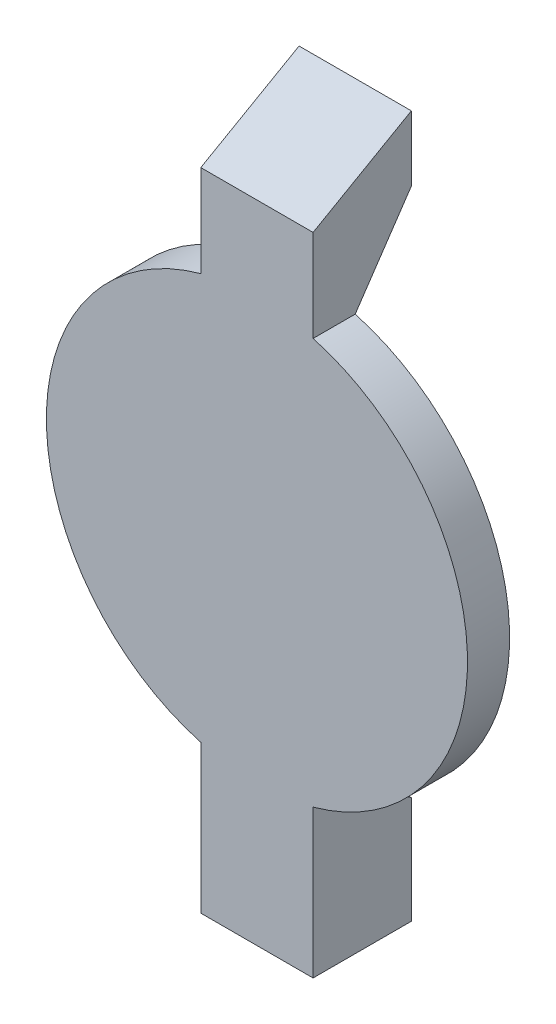
ISO-10303-21;
HEADER;
FILE_DESCRIPTION(('STEP AP214'),'2;1');
FILE_NAME('part.step','',(''),(''),'','','');
FILE_SCHEMA(('AUTOMOTIVE_DESIGN { 1 0 10303 214 1 1 1 1 }'));
ENDSEC;
DATA;
#1=APPLICATION_CONTEXT('core data for automotive mechanical design processes');
#2=APPLICATION_PROTOCOL_DEFINITION('international standard','automotive_design',2000,#1);
#3=PRODUCT_CONTEXT('',#1,'mechanical');
#4=PRODUCT('Part','Part','',(#3));
#5=PRODUCT_RELATED_PRODUCT_CATEGORY('part','',(#4));
#6=PRODUCT_DEFINITION_FORMATION('','',#4);
#7=PRODUCT_DEFINITION_CONTEXT('part definition',#1,'design');
#8=PRODUCT_DEFINITION('design','',#6,#7);
#9=PRODUCT_DEFINITION_SHAPE('','',#8);
#10=(LENGTH_UNIT() NAMED_UNIT(*) SI_UNIT(.MILLI.,.METRE.));
#11=(NAMED_UNIT(*) PLANE_ANGLE_UNIT() SI_UNIT($,.RADIAN.));
#12=(NAMED_UNIT(*) SI_UNIT($,.STERADIAN.) SOLID_ANGLE_UNIT());
#13=UNCERTAINTY_MEASURE_WITH_UNIT(LENGTH_MEASURE(1.E-05),#10,'distance_accuracy_value','');
#14=(GEOMETRIC_REPRESENTATION_CONTEXT(3) GLOBAL_UNCERTAINTY_ASSIGNED_CONTEXT((#13)) GLOBAL_UNIT_ASSIGNED_CONTEXT((#10,
#11,#12)) REPRESENTATION_CONTEXT('',''));
#15=CARTESIAN_POINT('',(0.,0.,0.));
#16=DIRECTION('',(0.,0.,1.));
#17=DIRECTION('',(1.,0.,0.));
#18=AXIS2_PLACEMENT_3D('',#15,#16,#17);
#19=CARTESIAN_POINT('',(-54.0645161290324,3.51612903225812,0.));
#20=DIRECTION('',(0.,0.,1.));
#21=DIRECTION('',(1.,0.,0.));
#22=AXIS2_PLACEMENT_3D('',#19,#20,#21);
#23=PLANE('',#22);
#24=DIRECTION('',(0.,1.,0.));
#25=VECTOR('',#24,1.);
#26=CARTESIAN_POINT('',(-50.0645161290324,28.5161290322581,0.));
#27=LINE('',#26,#25);
#28=CARTESIAN_POINT('',(-50.0645161290324,23.8720744897449,0.));
#29=VERTEX_POINT('',#28);
#30=CARTESIAN_POINT('',(-50.0645161290324,28.5161290322581,0.));
#31=VERTEX_POINT('',#30);
#32=EDGE_CURVE('E72',#29,#31,#27,.T.);
#33=ORIENTED_EDGE('',*,*,#32,.F.);
#34=DIRECTION('',(-1.,0.,0.));
#35=VECTOR('',#34,1.);
#36=CARTESIAN_POINT('',(-54.0645161290324,23.8720744897449,0.));
#37=LINE('',#36,#35);
#38=CARTESIAN_POINT('',(-58.0645161290324,23.8720744897449,0.));
#39=VERTEX_POINT('',#38);
#40=EDGE_CURVE('E11',#29,#39,#37,.T.);
#41=ORIENTED_EDGE('',*,*,#40,.T.);
#42=DIRECTION('',(0.,-1.,0.));
#43=VECTOR('',#42,1.);
#44=CARTESIAN_POINT('',(-58.0645161290324,28.5161290322581,0.));
#45=LINE('',#44,#43);
#46=CARTESIAN_POINT('',(-58.0645161290324,28.5161290322581,0.));
#47=VERTEX_POINT('',#46);
#48=EDGE_CURVE('E118',#47,#39,#45,.T.);
#49=ORIENTED_EDGE('',*,*,#48,.F.);
#50=DIRECTION('',(-1.,0.,0.));
#51=VECTOR('',#50,1.);
#52=CARTESIAN_POINT('',(-58.0645161290324,28.5161290322581,0.));
#53=LINE('',#52,#51);
#54=EDGE_CURVE('E128',#31,#47,#53,.T.);
#55=ORIENTED_EDGE('',*,*,#54,.F.);
#56=EDGE_LOOP('',(#33,#41,#49,#55));
#57=FACE_BOUND('',#56,.T.);
#58=ADVANCED_FACE('F32',(#57),#23,.F.);
#59=CARTESIAN_POINT('',(-58.0645161290324,28.5161290322581,7.));
#60=DIRECTION('',(1.,0.,0.));
#61=DIRECTION('',(0.,0.,-1.));
#62=AXIS2_PLACEMENT_3D('',#59,#60,#61);
#63=PLANE('',#62);
#64=DIRECTION('',(0.,-0.827669314342992,0.561216095719822));
#65=VECTOR('',#64,1.);
#66=CARTESIAN_POINT('',(-58.0645161290324,23.8720744897449,0.));
#67=LINE('',#66,#65);
#68=CARTESIAN_POINT('',(-58.0645161290324,17.9729613270591,4.));
#69=VERTEX_POINT('',#68);
#70=EDGE_CURVE('E204',#39,#69,#67,.T.);
#71=ORIENTED_EDGE('',*,*,#70,.T.);
#72=DIRECTION('',(0.,0.,-1.));
#73=VECTOR('',#72,1.);
#74=CARTESIAN_POINT('',(-58.0645161290324,17.9729613270591,7.));
#75=LINE('',#74,#73);
#76=CARTESIAN_POINT('',(-58.0645161290324,17.9729613270591,7.));
#77=VERTEX_POINT('',#76);
#78=EDGE_CURVE('E138',#77,#69,#75,.T.);
#79=ORIENTED_EDGE('',*,*,#78,.F.);
#80=DIRECTION('',(0.,-1.,0.));
#81=VECTOR('',#80,1.);
#82=CARTESIAN_POINT('',(-58.0645161290324,28.5161290322581,7.));
#83=LINE('',#82,#81);
#84=CARTESIAN_POINT('',(-58.0645161290324,24.5161290322581,7.));
#85=VERTEX_POINT('',#84);
#86=EDGE_CURVE('E80',#85,#77,#83,.T.);
#87=ORIENTED_EDGE('',*,*,#86,.F.);
#88=DIRECTION('',(0.,-0.496138938356834,0.868243142124459));
#89=VECTOR('',#88,1.);
#90=CARTESIAN_POINT('',(-58.0645161290324,24.5161290322581,7.));
#91=LINE('',#90,#89);
#92=EDGE_CURVE('E212',#47,#85,#91,.T.);
#93=ORIENTED_EDGE('',*,*,#92,.F.);
#94=ORIENTED_EDGE('',*,*,#48,.T.);
#95=EDGE_LOOP('',(#71,#79,#87,#93,#94));
#96=FACE_BOUND('',#95,.T.);
#97=ADVANCED_FACE('F34',(#96),#63,.F.);
#98=CARTESIAN_POINT('',(-54.0645161290324,3.51612903225812,7.));
#99=DIRECTION('',(0.,0.,-1.));
#100=DIRECTION('',(-1.,0.,0.));
#101=AXIS2_PLACEMENT_3D('',#98,#99,#100);
#102=CYLINDRICAL_SURFACE('',#101,15.);
#103=CARTESIAN_POINT('',(-54.0645161290324,3.51612903225812,4.));
#104=DIRECTION('',(0.,0.,1.));
#105=DIRECTION('',(0.,-1.,0.));
#106=AXIS2_PLACEMENT_3D('',#103,#104,#105);
#107=CIRCLE('',#106,15.);
#108=CARTESIAN_POINT('',(-58.0645161290324,-10.9407032625428,4.));
#109=VERTEX_POINT('',#108);
#110=EDGE_CURVE('E173',#69,#109,#107,.T.);
#111=ORIENTED_EDGE('',*,*,#110,.T.);
#112=DIRECTION('',(0.,0.,-1.));
#113=VECTOR('',#112,1.);
#114=CARTESIAN_POINT('',(-58.0645161290324,-10.9407032625428,7.));
#115=LINE('',#114,#113);
#116=CARTESIAN_POINT('',(-58.0645161290324,-10.9407032625428,7.));
#117=VERTEX_POINT('',#116);
#118=EDGE_CURVE('E135',#117,#109,#115,.T.);
#119=ORIENTED_EDGE('',*,*,#118,.F.);
#120=CARTESIAN_POINT('',(-54.0645161290324,3.51612903225812,7.));
#121=DIRECTION('',(0.,0.,1.));
#122=DIRECTION('',(1.,0.,0.));
#123=AXIS2_PLACEMENT_3D('',#120,#121,#122);
#124=CIRCLE('',#123,15.);
#125=EDGE_CURVE('E215',#77,#117,#124,.T.);
#126=ORIENTED_EDGE('',*,*,#125,.F.);
#127=ORIENTED_EDGE('',*,*,#78,.T.);
#128=EDGE_LOOP('',(#111,#119,#126,#127));
#129=FACE_BOUND('',#128,.T.);
#130=ADVANCED_FACE('F214',(#129),#102,.T.);
#131=CARTESIAN_POINT('',(-58.0645161290324,-10.9407032625428,7.));
#132=DIRECTION('',(1.,0.,0.));
#133=DIRECTION('',(0.,0.,-1.));
#134=AXIS2_PLACEMENT_3D('',#131,#132,#133);
#135=PLANE('',#134);
#136=ORIENTED_EDGE('',*,*,#118,.T.);
#137=DIRECTION('',(0.,-0.589013865697566,-0.808122927540117));
#138=VECTOR('',#137,1.);
#139=CARTESIAN_POINT('',(-58.0645161290324,-13.8561699353694,0.));
#140=LINE('',#139,#138);
#141=CARTESIAN_POINT('',(-58.0645161290324,-13.8561699353694,0.));
#142=VERTEX_POINT('',#141);
#143=EDGE_CURVE('E159',#109,#142,#140,.T.);
#144=ORIENTED_EDGE('',*,*,#143,.T.);
#145=DIRECTION('',(0.,-1.,0.));
#146=VECTOR('',#145,1.);
#147=CARTESIAN_POINT('',(-58.0645161290324,-10.9407032625428,0.));
#148=LINE('',#147,#146);
#149=CARTESIAN_POINT('',(-58.0645161290324,-21.4838709677419,0.));
#150=VERTEX_POINT('',#149);
#151=EDGE_CURVE('E121',#142,#150,#148,.T.);
#152=ORIENTED_EDGE('',*,*,#151,.T.);
#153=DIRECTION('',(0.,0.,-1.));
#154=VECTOR('',#153,1.);
#155=CARTESIAN_POINT('',(-58.0645161290324,-21.4838709677419,7.));
#156=LINE('',#155,#154);
#157=CARTESIAN_POINT('',(-58.0645161290324,-21.4838709677419,7.));
#158=VERTEX_POINT('',#157);
#159=EDGE_CURVE('E105',#158,#150,#156,.T.);
#160=ORIENTED_EDGE('',*,*,#159,.F.);
#161=DIRECTION('',(0.,-1.,0.));
#162=VECTOR('',#161,1.);
#163=CARTESIAN_POINT('',(-58.0645161290324,-10.9407032625428,7.));
#164=LINE('',#163,#162);
#165=EDGE_CURVE('E97',#117,#158,#164,.T.);
#166=ORIENTED_EDGE('',*,*,#165,.F.);
#167=EDGE_LOOP('',(#136,#144,#152,#160,#166));
#168=FACE_BOUND('',#167,.T.);
#169=ADVANCED_FACE('F293',(#168),#135,.F.);
#170=CARTESIAN_POINT('',(-58.0645161290324,-21.4838709677419,7.));
#171=DIRECTION('',(0.,1.,0.));
#172=DIRECTION('',(0.,0.,1.));
#173=AXIS2_PLACEMENT_3D('',#170,#171,#172);
#174=PLANE('',#173);
#175=CARTESIAN_POINT('',(-54.0645161290324,-21.4838709677419,3.5));
#176=DIRECTION('',(0.,-1.,0.));
#177=DIRECTION('',(0.,0.,-1.));
#178=AXIS2_PLACEMENT_3D('',#175,#176,#177);
#179=CIRCLE('',#178,2.4);
#180=CARTESIAN_POINT('',(-54.0645161290324,-21.4838709677419,1.1));
#181=VERTEX_POINT('',#180);
#182=EDGE_CURVE('E219',#181,#181,#179,.T.);
#183=ORIENTED_EDGE('',*,*,#182,.F.);
#184=EDGE_LOOP('',(#183));
#185=FACE_BOUND('',#184,.T.);
#186=DIRECTION('',(1.,0.,0.));
#187=VECTOR('',#186,1.);
#188=CARTESIAN_POINT('',(-58.0645161290324,-21.4838709677419,0.));
#189=LINE('',#188,#187);
#190=CARTESIAN_POINT('',(-50.0645161290324,-21.4838709677419,0.));
#191=VERTEX_POINT('',#190);
#192=EDGE_CURVE('E64',#150,#191,#189,.T.);
#193=ORIENTED_EDGE('',*,*,#192,.T.);
#194=DIRECTION('',(0.,0.,-1.));
#195=VECTOR('',#194,1.);
#196=CARTESIAN_POINT('',(-50.0645161290324,-21.4838709677419,7.));
#197=LINE('',#196,#195);
#198=CARTESIAN_POINT('',(-50.0645161290324,-21.4838709677419,7.));
#199=VERTEX_POINT('',#198);
#200=EDGE_CURVE('E100',#199,#191,#197,.T.);
#201=ORIENTED_EDGE('',*,*,#200,.F.);
#202=DIRECTION('',(1.,0.,0.));
#203=VECTOR('',#202,1.);
#204=CARTESIAN_POINT('',(-58.0645161290324,-21.4838709677419,7.));
#205=LINE('',#204,#203);
#206=EDGE_CURVE('E91',#158,#199,#205,.T.);
#207=ORIENTED_EDGE('',*,*,#206,.F.);
#208=ORIENTED_EDGE('',*,*,#159,.T.);
#209=EDGE_LOOP('',(#193,#201,#207,#208));
#210=FACE_BOUND('',#209,.T.);
#211=ADVANCED_FACE('F101',(#185,#210),#174,.F.);
#212=CARTESIAN_POINT('',(-50.0645161290324,-10.9407032625428,7.));
#213=DIRECTION('',(-1.,0.,0.));
#214=DIRECTION('',(0.,-1.,0.));
#215=AXIS2_PLACEMENT_3D('',#212,#213,#214);
#216=PLANE('',#215);
#217=DIRECTION('',(0.,-0.589013865697566,-0.808122927540117));
#218=VECTOR('',#217,1.);
#219=CARTESIAN_POINT('',(-50.0645161290324,-13.8561699353694,0.));
#220=LINE('',#219,#218);
#221=CARTESIAN_POINT('',(-50.0645161290324,-10.9407032625428,4.));
#222=VERTEX_POINT('',#221);
#223=CARTESIAN_POINT('',(-50.0645161290324,-13.8561699353694,0.));
#224=VERTEX_POINT('',#223);
#225=EDGE_CURVE('E153',#222,#224,#220,.T.);
#226=ORIENTED_EDGE('',*,*,#225,.F.);
#227=DIRECTION('',(0.,0.,-1.));
#228=VECTOR('',#227,1.);
#229=CARTESIAN_POINT('',(-50.0645161290324,-10.9407032625428,7.));
#230=LINE('',#229,#228);
#231=CARTESIAN_POINT('',(-50.0645161290324,-10.9407032625428,7.));
#232=VERTEX_POINT('',#231);
#233=EDGE_CURVE('E106',#232,#222,#230,.T.);
#234=ORIENTED_EDGE('',*,*,#233,.F.);
#235=DIRECTION('',(0.,1.,0.));
#236=VECTOR('',#235,1.);
#237=CARTESIAN_POINT('',(-50.0645161290324,-10.9407032625428,7.));
#238=LINE('',#237,#236);
#239=EDGE_CURVE('E94',#199,#232,#238,.T.);
#240=ORIENTED_EDGE('',*,*,#239,.F.);
#241=ORIENTED_EDGE('',*,*,#200,.T.);
#242=DIRECTION('',(0.,1.,0.));
#243=VECTOR('',#242,1.);
#244=CARTESIAN_POINT('',(-50.0645161290324,-10.9407032625428,0.));
#245=LINE('',#244,#243);
#246=EDGE_CURVE('E125',#191,#224,#245,.T.);
#247=ORIENTED_EDGE('',*,*,#246,.T.);
#248=EDGE_LOOP('',(#226,#234,#240,#241,#247));
#249=FACE_BOUND('',#248,.T.);
#250=ADVANCED_FACE('F109',(#249),#216,.F.);
#251=CARTESIAN_POINT('',(-54.0645161290324,3.51612903225812,7.));
#252=DIRECTION('',(0.,0.,-1.));
#253=DIRECTION('',(-1.,0.,0.));
#254=AXIS2_PLACEMENT_3D('',#251,#252,#253);
#255=CYLINDRICAL_SURFACE('',#254,15.);
#256=ORIENTED_EDGE('',*,*,#233,.T.);
#257=CARTESIAN_POINT('',(-54.0645161290324,3.51612903225812,4.));
#258=DIRECTION('',(0.,0.,1.));
#259=DIRECTION('',(0.,-1.,0.));
#260=AXIS2_PLACEMENT_3D('',#257,#258,#259);
#261=CIRCLE('',#260,15.);
#262=CARTESIAN_POINT('',(-50.0645161290324,17.9729613270591,4.));
#263=VERTEX_POINT('',#262);
#264=EDGE_CURVE('E165',#222,#263,#261,.T.);
#265=ORIENTED_EDGE('',*,*,#264,.T.);
#266=DIRECTION('',(0.,0.,-1.));
#267=VECTOR('',#266,1.);
#268=CARTESIAN_POINT('',(-50.0645161290324,17.9729613270591,7.));
#269=LINE('',#268,#267);
#270=CARTESIAN_POINT('',(-50.0645161290324,17.9729613270591,7.));
#271=VERTEX_POINT('',#270);
#272=EDGE_CURVE('E117',#271,#263,#269,.T.);
#273=ORIENTED_EDGE('',*,*,#272,.F.);
#274=CARTESIAN_POINT('',(-54.0645161290324,3.51612903225812,7.));
#275=DIRECTION('',(0.,0.,1.));
#276=DIRECTION('',(-1.,0.,0.));
#277=AXIS2_PLACEMENT_3D('',#274,#275,#276);
#278=CIRCLE('',#277,15.);
#279=EDGE_CURVE('E49',#232,#271,#278,.T.);
#280=ORIENTED_EDGE('',*,*,#279,.F.);
#281=EDGE_LOOP('',(#256,#265,#273,#280));
#282=FACE_BOUND('',#281,.T.);
#283=ADVANCED_FACE('F175',(#282),#255,.T.);
#284=CARTESIAN_POINT('',(-50.0645161290324,28.5161290322581,7.));
#285=DIRECTION('',(-1.,0.,0.));
#286=DIRECTION('',(0.,0.,1.));
#287=AXIS2_PLACEMENT_3D('',#284,#285,#286);
#288=PLANE('',#287);
#289=ORIENTED_EDGE('',*,*,#272,.T.);
#290=DIRECTION('',(0.,-0.827669314342992,0.561216095719822));
#291=VECTOR('',#290,1.);
#292=CARTESIAN_POINT('',(-50.0645161290324,23.8720744897449,0.));
#293=LINE('',#292,#291);
#294=EDGE_CURVE('E196',#29,#263,#293,.T.);
#295=ORIENTED_EDGE('',*,*,#294,.F.);
#296=ORIENTED_EDGE('',*,*,#32,.T.);
#297=DIRECTION('',(0.,-0.496138938356834,0.868243142124459));
#298=VECTOR('',#297,1.);
#299=CARTESIAN_POINT('',(-50.0645161290324,24.5161290322581,7.));
#300=LINE('',#299,#298);
#301=CARTESIAN_POINT('',(-50.0645161290324,24.5161290322581,7.));
#302=VERTEX_POINT('',#301);
#303=EDGE_CURVE('E178',#31,#302,#300,.T.);
#304=ORIENTED_EDGE('',*,*,#303,.T.);
#305=DIRECTION('',(0.,1.,0.));
#306=VECTOR('',#305,1.);
#307=CARTESIAN_POINT('',(-50.0645161290324,28.5161290322581,7.));
#308=LINE('',#307,#306);
#309=EDGE_CURVE('E112',#271,#302,#308,.T.);
#310=ORIENTED_EDGE('',*,*,#309,.F.);
#311=EDGE_LOOP('',(#289,#295,#296,#304,#310));
#312=FACE_BOUND('',#311,.T.);
#313=ADVANCED_FACE('F177',(#312),#288,.F.);
#314=CARTESIAN_POINT('',(-54.0645161290324,3.51612903225812,7.));
#315=DIRECTION('',(0.,0.,1.));
#316=DIRECTION('',(1.,0.,0.));
#317=AXIS2_PLACEMENT_3D('',#314,#315,#316);
#318=PLANE('',#317);
#319=DIRECTION('',(-1.,0.,0.));
#320=VECTOR('',#319,1.);
#321=CARTESIAN_POINT('',(-50.0645161290324,24.5161290322581,7.));
#322=LINE('',#321,#320);
#323=EDGE_CURVE('E180',#302,#85,#322,.T.);
#324=ORIENTED_EDGE('',*,*,#323,.T.);
#325=ORIENTED_EDGE('',*,*,#86,.T.);
#326=ORIENTED_EDGE('',*,*,#125,.T.);
#327=ORIENTED_EDGE('',*,*,#165,.T.);
#328=ORIENTED_EDGE('',*,*,#206,.T.);
#329=ORIENTED_EDGE('',*,*,#239,.T.);
#330=ORIENTED_EDGE('',*,*,#279,.T.);
#331=ORIENTED_EDGE('',*,*,#309,.T.);
#332=EDGE_LOOP('',(#324,#325,#326,#327,#328,#329,#330,#331));
#333=FACE_BOUND('',#332,.T.);
#334=ADVANCED_FACE('F92',(#333),#318,.T.);
#335=ORIENTED_EDGE('',*,*,#151,.F.);
#336=DIRECTION('',(1.,0.,0.));
#337=VECTOR('',#336,1.);
#338=CARTESIAN_POINT('',(-54.0645161290324,-13.8561699353694,0.));
#339=LINE('',#338,#337);
#340=EDGE_CURVE('E41',#142,#224,#339,.T.);
#341=ORIENTED_EDGE('',*,*,#340,.T.);
#342=ORIENTED_EDGE('',*,*,#246,.F.);
#343=ORIENTED_EDGE('',*,*,#192,.F.);
#344=EDGE_LOOP('',(#335,#341,#342,#343));
#345=FACE_BOUND('',#344,.T.);
#346=ADVANCED_FACE('F145',(#345),#23,.F.);
#347=CARTESIAN_POINT('',(-54.0645161290324,-16.4838709677419,3.5));
#348=DIRECTION('',(0.,-1.,0.));
#349=DIRECTION('',(0.,0.,-1.));
#350=AXIS2_PLACEMENT_3D('',#347,#348,#349);
#351=CYLINDRICAL_SURFACE('',#350,2.4);
#352=CARTESIAN_POINT('',(-54.0645161290324,-16.4838709677419,3.5));
#353=DIRECTION('',(0.,-1.,0.));
#354=DIRECTION('',(0.,0.,-1.));
#355=AXIS2_PLACEMENT_3D('',#352,#353,#354);
#356=CIRCLE('',#355,2.4);
#357=CARTESIAN_POINT('',(-54.0645161290324,-16.4838709677419,1.1));
#358=VERTEX_POINT('',#357);
#359=EDGE_CURVE('E122',#358,#358,#356,.T.);
#360=ORIENTED_EDGE('',*,*,#359,.F.);
#361=EDGE_LOOP('',(#360));
#362=FACE_BOUND('',#361,.T.);
#363=ORIENTED_EDGE('',*,*,#182,.T.);
#364=EDGE_LOOP('',(#363));
#365=FACE_BOUND('',#364,.T.);
#366=ADVANCED_FACE('F239',(#362,#365),#351,.F.);
#367=CARTESIAN_POINT('',(-54.0645161290324,-16.4838709677419,3.5));
#368=DIRECTION('',(0.,-1.,0.));
#369=DIRECTION('',(0.,0.,-1.));
#370=AXIS2_PLACEMENT_3D('',#367,#368,#369);
#371=PLANE('',#370);
#372=ORIENTED_EDGE('',*,*,#359,.T.);
#373=EDGE_LOOP('',(#372));
#374=FACE_BOUND('',#373,.T.);
#375=ADVANCED_FACE('F244',(#374),#371,.T.);
#376=CARTESIAN_POINT('',(-50.0645161290324,24.5161290322581,7.));
#377=DIRECTION('',(0.,-0.868243142124459,-0.496138938356834));
#378=DIRECTION('',(0.,0.496138938356834,-0.868243142124459));
#379=AXIS2_PLACEMENT_3D('',#376,#377,#378);
#380=PLANE('',#379);
#381=ORIENTED_EDGE('',*,*,#92,.T.);
#382=ORIENTED_EDGE('',*,*,#323,.F.);
#383=ORIENTED_EDGE('',*,*,#303,.F.);
#384=ORIENTED_EDGE('',*,*,#54,.T.);
#385=EDGE_LOOP('',(#381,#382,#383,#384));
#386=FACE_BOUND('',#385,.T.);
#387=ADVANCED_FACE('F229',(#386),#380,.F.);
#388=CARTESIAN_POINT('',(-29.0645161290324,23.8720744897449,4.));
#389=DIRECTION('',(0.,0.,1.));
#390=DIRECTION('',(0.,-1.,0.));
#391=AXIS2_PLACEMENT_3D('',#388,#389,#390);
#392=PLANE('',#391);
#393=ORIENTED_EDGE('',*,*,#264,.F.);
#394=DIRECTION('',(-1.,0.,0.));
#395=VECTOR('',#394,1.);
#396=CARTESIAN_POINT('',(-50.0645161290324,-10.9407032625428,4.));
#397=LINE('',#396,#395);
#398=EDGE_CURVE('E158',#222,#109,#397,.T.);
#399=ORIENTED_EDGE('',*,*,#398,.T.);
#400=ORIENTED_EDGE('',*,*,#110,.F.);
#401=DIRECTION('',(-1.,0.,0.));
#402=VECTOR('',#401,1.);
#403=CARTESIAN_POINT('',(-50.0645161290324,17.9729613270591,4.));
#404=LINE('',#403,#402);
#405=EDGE_CURVE('E171',#263,#69,#404,.T.);
#406=ORIENTED_EDGE('',*,*,#405,.F.);
#407=EDGE_LOOP('',(#393,#399,#400,#406));
#408=FACE_BOUND('',#407,.T.);
#409=ADVANCED_FACE('F166',(#408),#392,.F.);
#410=CARTESIAN_POINT('',(-50.0645161290324,23.8720744897449,0.));
#411=DIRECTION('',(0.,-0.561216095719822,-0.827669314342992));
#412=DIRECTION('',(0.,0.827669314342992,-0.561216095719822));
#413=AXIS2_PLACEMENT_3D('',#410,#411,#412);
#414=PLANE('',#413);
#415=ORIENTED_EDGE('',*,*,#70,.F.);
#416=ORIENTED_EDGE('',*,*,#40,.F.);
#417=ORIENTED_EDGE('',*,*,#294,.T.);
#418=ORIENTED_EDGE('',*,*,#405,.T.);
#419=EDGE_LOOP('',(#415,#416,#417,#418));
#420=FACE_BOUND('',#419,.T.);
#421=ADVANCED_FACE('F203',(#420),#414,.T.);
#422=CARTESIAN_POINT('',(-50.0645161290324,-13.8561699353694,0.));
#423=DIRECTION('',(0.,0.808122927540117,-0.589013865697566));
#424=DIRECTION('',(0.,0.589013865697566,0.808122927540117));
#425=AXIS2_PLACEMENT_3D('',#422,#423,#424);
#426=PLANE('',#425);
#427=ORIENTED_EDGE('',*,*,#143,.F.);
#428=ORIENTED_EDGE('',*,*,#398,.F.);
#429=ORIENTED_EDGE('',*,*,#225,.T.);
#430=ORIENTED_EDGE('',*,*,#340,.F.);
#431=EDGE_LOOP('',(#427,#428,#429,#430));
#432=FACE_BOUND('',#431,.T.);
#433=ADVANCED_FACE('F260',(#432),#426,.T.);
#434=CLOSED_SHELL('',(#58,#97,#130,#169,#211,#250,#283,#313,#334,#346,#366,#375,#387,#409,#421,#433));
#435=MANIFOLD_SOLID_BREP('B2',#434);
#436=ADVANCED_BREP_SHAPE_REPRESENTATION('',(#18,#435),#14);
#437=SHAPE_DEFINITION_REPRESENTATION(#9,#436);
ENDSEC;
END-ISO-10303-21;
